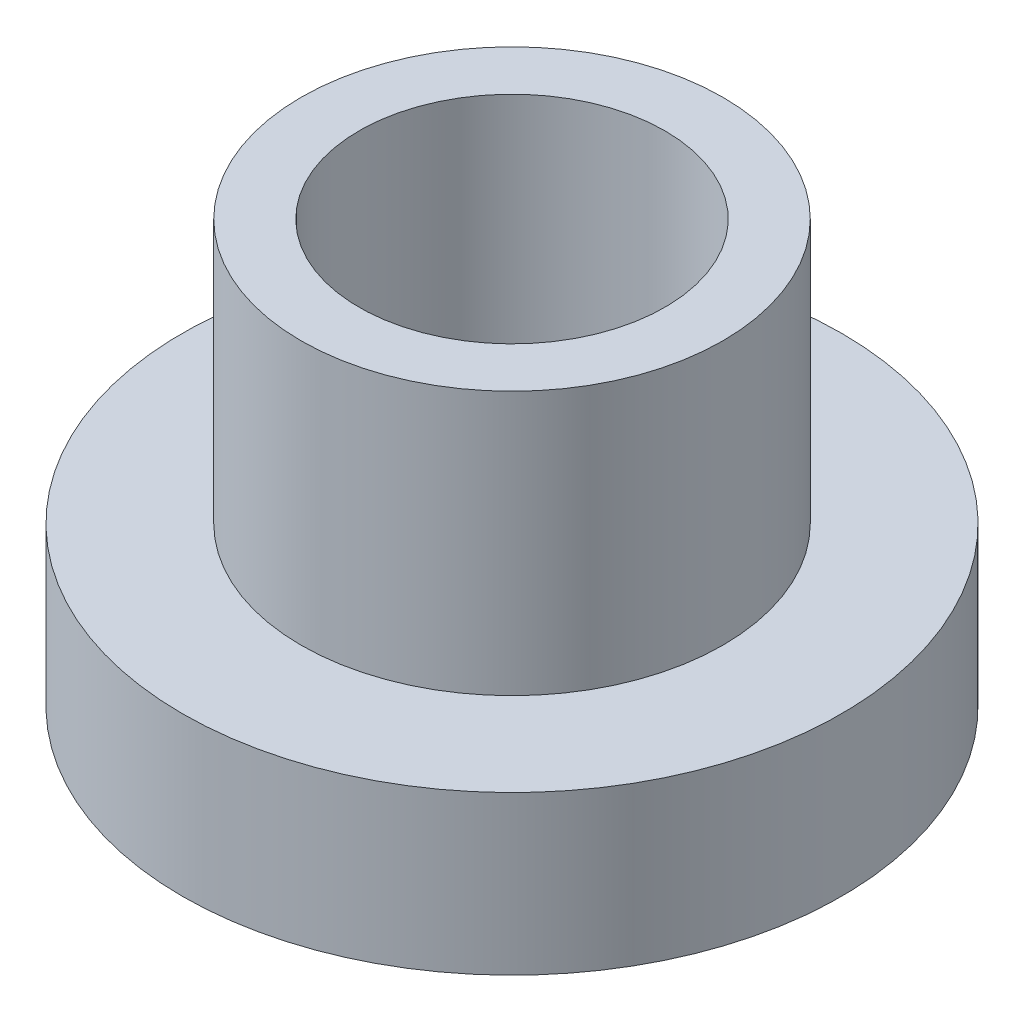
ISO-10303-21;
HEADER;
FILE_DESCRIPTION(('STEP AP214'),'2;1');
FILE_NAME('part.step','',(''),(''),'','','');
FILE_SCHEMA(('AUTOMOTIVE_DESIGN { 1 0 10303 214 1 1 1 1 }'));
ENDSEC;
DATA;
#1=APPLICATION_CONTEXT('core data for automotive mechanical design processes');
#2=APPLICATION_PROTOCOL_DEFINITION('international standard','automotive_design',2000,#1);
#3=PRODUCT_CONTEXT('',#1,'mechanical');
#4=PRODUCT('Part','Part','',(#3));
#5=PRODUCT_RELATED_PRODUCT_CATEGORY('part','',(#4));
#6=PRODUCT_DEFINITION_FORMATION('','',#4);
#7=PRODUCT_DEFINITION_CONTEXT('part definition',#1,'design');
#8=PRODUCT_DEFINITION('design','',#6,#7);
#9=PRODUCT_DEFINITION_SHAPE('','',#8);
#10=(LENGTH_UNIT() NAMED_UNIT(*) SI_UNIT(.MILLI.,.METRE.));
#11=(NAMED_UNIT(*) PLANE_ANGLE_UNIT() SI_UNIT($,.RADIAN.));
#12=(NAMED_UNIT(*) SI_UNIT($,.STERADIAN.) SOLID_ANGLE_UNIT());
#13=UNCERTAINTY_MEASURE_WITH_UNIT(LENGTH_MEASURE(1.E-05),#10,'distance_accuracy_value','');
#14=(GEOMETRIC_REPRESENTATION_CONTEXT(3) GLOBAL_UNCERTAINTY_ASSIGNED_CONTEXT((#13)) GLOBAL_UNIT_ASSIGNED_CONTEXT((#10,
#11,#12)) REPRESENTATION_CONTEXT('',''));
#15=CARTESIAN_POINT('',(0.,0.,0.));
#16=DIRECTION('',(0.,0.,1.));
#17=DIRECTION('',(1.,0.,0.));
#18=AXIS2_PLACEMENT_3D('',#15,#16,#17);
#19=CARTESIAN_POINT('',(0.,5.,0.));
#20=DIRECTION('',(0.,-1.,0.));
#21=DIRECTION('',(0.,0.,-1.));
#22=AXIS2_PLACEMENT_3D('',#19,#20,#21);
#23=CYLINDRICAL_SURFACE('',#22,4.);
#24=CARTESIAN_POINT('',(0.,5.,0.));
#25=DIRECTION('',(0.,1.,0.));
#26=DIRECTION('',(0.,0.,1.));
#27=AXIS2_PLACEMENT_3D('',#24,#25,#26);
#28=CIRCLE('',#27,4.);
#29=CARTESIAN_POINT('',(0.,5.,4.));
#30=VERTEX_POINT('',#29);
#31=EDGE_CURVE('E10',#30,#30,#28,.T.);
#32=ORIENTED_EDGE('',*,*,#31,.F.);
#33=EDGE_LOOP('',(#32));
#34=FACE_BOUND('',#33,.T.);
#35=CARTESIAN_POINT('',(0.,0.,0.));
#36=DIRECTION('',(0.,1.,0.));
#37=DIRECTION('',(0.,0.,1.));
#38=AXIS2_PLACEMENT_3D('',#35,#36,#37);
#39=CIRCLE('',#38,4.);
#40=CARTESIAN_POINT('',(0.,0.,4.));
#41=VERTEX_POINT('',#40);
#42=EDGE_CURVE('E34',#41,#41,#39,.T.);
#43=ORIENTED_EDGE('',*,*,#42,.T.);
#44=EDGE_LOOP('',(#43));
#45=FACE_BOUND('',#44,.T.);
#46=ADVANCED_FACE('F31',(#34,#45),#23,.T.);
#47=CARTESIAN_POINT('',(0.,5.,0.));
#48=DIRECTION('',(0.,1.,0.));
#49=DIRECTION('',(0.,0.,1.));
#50=AXIS2_PLACEMENT_3D('',#47,#48,#49);
#51=PLANE('',#50);
#52=CARTESIAN_POINT('',(0.,5.,0.));
#53=DIRECTION('',(0.,-1.,0.));
#54=DIRECTION('',(0.,0.,-1.));
#55=AXIS2_PLACEMENT_3D('',#52,#53,#54);
#56=CIRCLE('',#55,2.9);
#57=CARTESIAN_POINT('',(0.,5.,-2.9));
#58=VERTEX_POINT('',#57);
#59=EDGE_CURVE('E46',#58,#58,#56,.T.);
#60=ORIENTED_EDGE('',*,*,#59,.T.);
#61=EDGE_LOOP('',(#60));
#62=FACE_BOUND('',#61,.T.);
#63=ORIENTED_EDGE('',*,*,#31,.T.);
#64=EDGE_LOOP('',(#63));
#65=FACE_BOUND('',#64,.T.);
#66=ADVANCED_FACE('F70',(#62,#65),#51,.T.);
#67=CARTESIAN_POINT('',(0.,-3.,0.));
#68=DIRECTION('',(0.,1.,0.));
#69=DIRECTION('',(0.,0.,1.));
#70=AXIS2_PLACEMENT_3D('',#67,#68,#69);
#71=CYLINDRICAL_SURFACE('',#70,6.25);
#72=CARTESIAN_POINT('',(0.,-3.,0.));
#73=DIRECTION('',(0.,-1.,0.));
#74=DIRECTION('',(0.,0.,-1.));
#75=AXIS2_PLACEMENT_3D('',#72,#73,#74);
#76=CIRCLE('',#75,6.25);
#77=CARTESIAN_POINT('',(0.,-3.,-6.25));
#78=VERTEX_POINT('',#77);
#79=EDGE_CURVE('E41',#78,#78,#76,.T.);
#80=ORIENTED_EDGE('',*,*,#79,.F.);
#81=EDGE_LOOP('',(#80));
#82=FACE_BOUND('',#81,.T.);
#83=CARTESIAN_POINT('',(0.,0.,0.));
#84=DIRECTION('',(0.,-1.,0.));
#85=DIRECTION('',(0.,0.,-1.));
#86=AXIS2_PLACEMENT_3D('',#83,#84,#85);
#87=CIRCLE('',#86,6.25);
#88=CARTESIAN_POINT('',(0.,0.,-6.25));
#89=VERTEX_POINT('',#88);
#90=EDGE_CURVE('E43',#89,#89,#87,.T.);
#91=ORIENTED_EDGE('',*,*,#90,.T.);
#92=EDGE_LOOP('',(#91));
#93=FACE_BOUND('',#92,.T.);
#94=ADVANCED_FACE('F64',(#82,#93),#71,.T.);
#95=CARTESIAN_POINT('',(0.,-3.,0.));
#96=DIRECTION('',(0.,-1.,0.));
#97=DIRECTION('',(0.,0.,-1.));
#98=AXIS2_PLACEMENT_3D('',#95,#96,#97);
#99=PLANE('',#98);
#100=CARTESIAN_POINT('',(0.,-3.,0.));
#101=DIRECTION('',(0.,-1.,0.));
#102=DIRECTION('',(0.,0.,-1.));
#103=AXIS2_PLACEMENT_3D('',#100,#101,#102);
#104=CIRCLE('',#103,5.735);
#105=CARTESIAN_POINT('',(0.,-3.,-5.735));
#106=VERTEX_POINT('',#105);
#107=EDGE_CURVE('E54',#106,#106,#104,.T.);
#108=ORIENTED_EDGE('',*,*,#107,.F.);
#109=EDGE_LOOP('',(#108));
#110=FACE_BOUND('',#109,.T.);
#111=ORIENTED_EDGE('',*,*,#79,.T.);
#112=EDGE_LOOP('',(#111));
#113=FACE_BOUND('',#112,.T.);
#114=ADVANCED_FACE('F60',(#110,#113),#99,.T.);
#115=CARTESIAN_POINT('',(0.,0.,0.));
#116=DIRECTION('',(0.,-1.,0.));
#117=DIRECTION('',(0.,0.,-1.));
#118=AXIS2_PLACEMENT_3D('',#115,#116,#117);
#119=PLANE('',#118);
#120=ORIENTED_EDGE('',*,*,#42,.F.);
#121=EDGE_LOOP('',(#120));
#122=FACE_BOUND('',#121,.T.);
#123=ORIENTED_EDGE('',*,*,#90,.F.);
#124=EDGE_LOOP('',(#123));
#125=FACE_BOUND('',#124,.T.);
#126=ADVANCED_FACE('F63',(#122,#125),#119,.F.);
#127=CARTESIAN_POINT('',(0.,-3.,0.));
#128=DIRECTION('',(0.,-1.,0.));
#129=DIRECTION('',(0.,0.,-1.));
#130=AXIS2_PLACEMENT_3D('',#127,#128,#129);
#131=CYLINDRICAL_SURFACE('',#130,2.9);
#132=ORIENTED_EDGE('',*,*,#59,.F.);
#133=EDGE_LOOP('',(#132));
#134=FACE_BOUND('',#133,.T.);
#135=CARTESIAN_POINT('',(0.,-0.164999999999999,0.));
#136=DIRECTION('',(0.,-1.,0.));
#137=DIRECTION('',(0.,0.,-1.));
#138=AXIS2_PLACEMENT_3D('',#135,#136,#137);
#139=CIRCLE('',#138,2.9);
#140=CARTESIAN_POINT('',(0.,-0.164999999999999,-2.9));
#141=VERTEX_POINT('',#140);
#142=EDGE_CURVE('E51',#141,#141,#139,.T.);
#143=ORIENTED_EDGE('',*,*,#142,.T.);
#144=EDGE_LOOP('',(#143));
#145=FACE_BOUND('',#144,.T.);
#146=ADVANCED_FACE('F75',(#134,#145),#131,.F.);
#147=CARTESIAN_POINT('',(0.,-3.,0.));
#148=DIRECTION('',(0.,-1.,0.));
#149=DIRECTION('',(0.,0.,-1.));
#150=AXIS2_PLACEMENT_3D('',#147,#148,#149);
#151=CONICAL_SURFACE('',#150,5.735,0.785398163397449);
#152=ORIENTED_EDGE('',*,*,#142,.F.);
#153=EDGE_LOOP('',(#152));
#154=FACE_BOUND('',#153,.T.);
#155=ORIENTED_EDGE('',*,*,#107,.T.);
#156=EDGE_LOOP('',(#155));
#157=FACE_BOUND('',#156,.T.);
#158=ADVANCED_FACE('F58',(#154,#157),#151,.F.);
#159=CLOSED_SHELL('',(#46,#66,#94,#114,#126,#146,#158));
#160=MANIFOLD_SOLID_BREP('B2',#159);
#161=ADVANCED_BREP_SHAPE_REPRESENTATION('',(#18,#160),#14);
#162=SHAPE_DEFINITION_REPRESENTATION(#9,#161);
ENDSEC;
END-ISO-10303-21;
